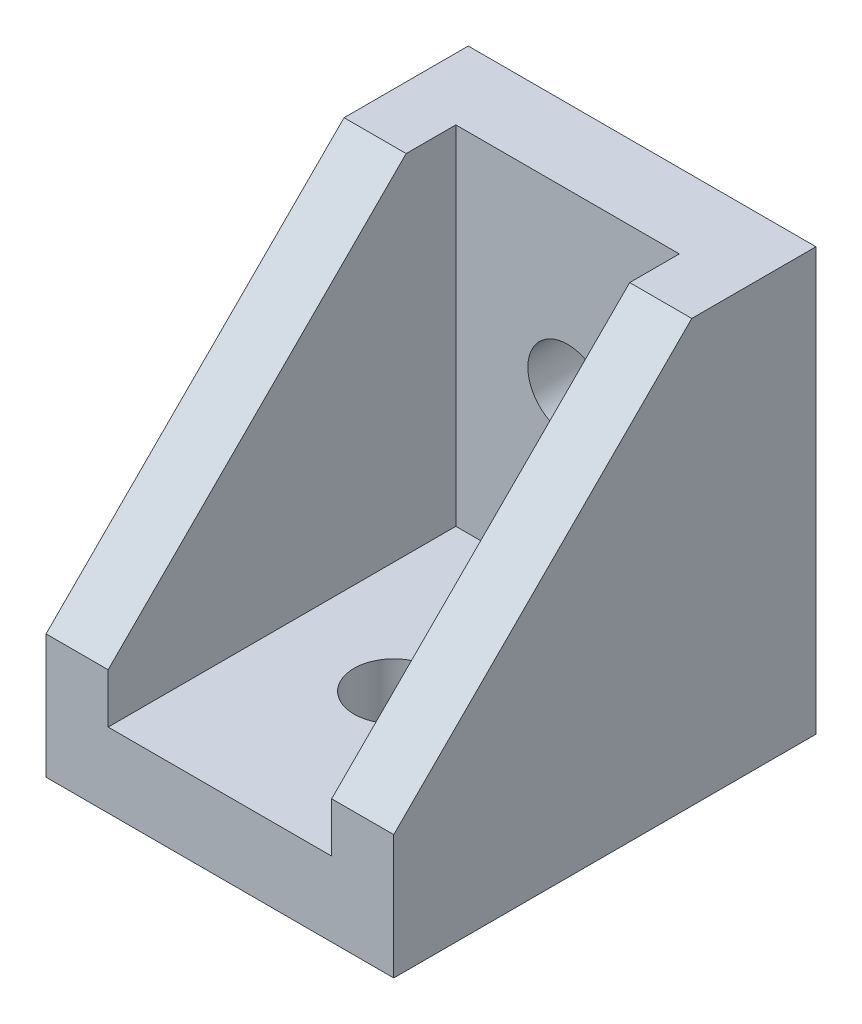
ISO-10303-21;
HEADER;
FILE_DESCRIPTION(('STEP AP214'),'2;1');
FILE_NAME('part.step','',(''),(''),'','','');
FILE_SCHEMA(('AUTOMOTIVE_DESIGN { 1 0 10303 214 1 1 1 1 }'));
ENDSEC;
DATA;
#1=APPLICATION_CONTEXT('core data for automotive mechanical design processes');
#2=APPLICATION_PROTOCOL_DEFINITION('international standard','automotive_design',2000,#1);
#3=PRODUCT_CONTEXT('',#1,'mechanical');
#4=PRODUCT('Part','Part','',(#3));
#5=PRODUCT_RELATED_PRODUCT_CATEGORY('part','',(#4));
#6=PRODUCT_DEFINITION_FORMATION('','',#4);
#7=PRODUCT_DEFINITION_CONTEXT('part definition',#1,'design');
#8=PRODUCT_DEFINITION('design','',#6,#7);
#9=PRODUCT_DEFINITION_SHAPE('','',#8);
#10=(LENGTH_UNIT() NAMED_UNIT(*) SI_UNIT(.MILLI.,.METRE.));
#11=(NAMED_UNIT(*) PLANE_ANGLE_UNIT() SI_UNIT($,.RADIAN.));
#12=(NAMED_UNIT(*) SI_UNIT($,.STERADIAN.) SOLID_ANGLE_UNIT());
#13=UNCERTAINTY_MEASURE_WITH_UNIT(LENGTH_MEASURE(1.E-05),#10,'distance_accuracy_value','');
#14=(GEOMETRIC_REPRESENTATION_CONTEXT(3) GLOBAL_UNCERTAINTY_ASSIGNED_CONTEXT((#13)) GLOBAL_UNIT_ASSIGNED_CONTEXT((#10,
#11,#12)) REPRESENTATION_CONTEXT('',''));
#15=CARTESIAN_POINT('',(0.,0.,0.));
#16=DIRECTION('',(0.,0.,1.));
#17=DIRECTION('',(1.,0.,0.));
#18=AXIS2_PLACEMENT_3D('',#15,#16,#17);
#19=CARTESIAN_POINT('',(0.,3.,0.));
#20=DIRECTION('',(0.,-1.,0.));
#21=DIRECTION('',(0.,0.,-1.));
#22=AXIS2_PLACEMENT_3D('',#19,#20,#21);
#23=PLANE('',#22);
#24=DIRECTION('',(1.,0.,0.));
#25=VECTOR('',#24,1.);
#26=CARTESIAN_POINT('',(-7.,3.,7.));
#27=LINE('',#26,#25);
#28=CARTESIAN_POINT('',(-4.5,3.,7.));
#29=VERTEX_POINT('',#28);
#30=CARTESIAN_POINT('',(4.5,3.,7.));
#31=VERTEX_POINT('',#30);
#32=EDGE_CURVE('E129',#29,#31,#27,.T.);
#33=ORIENTED_EDGE('',*,*,#32,.T.);
#34=DIRECTION('',(0.,0.,-1.));
#35=VECTOR('',#34,1.);
#36=CARTESIAN_POINT('',(4.5,3.,7.));
#37=LINE('',#36,#35);
#38=CARTESIAN_POINT('',(4.5,3.,-7.));
#39=VERTEX_POINT('',#38);
#40=EDGE_CURVE('E254',#31,#39,#37,.T.);
#41=ORIENTED_EDGE('',*,*,#40,.T.);
#42=DIRECTION('',(-1.,0.,0.));
#43=VECTOR('',#42,1.);
#44=CARTESIAN_POINT('',(-7.,3.,-7.));
#45=LINE('',#44,#43);
#46=CARTESIAN_POINT('',(-4.5,3.,-7.));
#47=VERTEX_POINT('',#46);
#48=EDGE_CURVE('E217',#39,#47,#45,.T.);
#49=ORIENTED_EDGE('',*,*,#48,.T.);
#50=DIRECTION('',(0.,0.,-1.));
#51=VECTOR('',#50,1.);
#52=CARTESIAN_POINT('',(-4.5,3.,7.));
#53=LINE('',#52,#51);
#54=EDGE_CURVE('E156',#29,#47,#53,.T.);
#55=ORIENTED_EDGE('',*,*,#54,.F.);
#56=EDGE_LOOP('',(#33,#41,#49,#55));
#57=FACE_BOUND('',#56,.T.);
#58=CARTESIAN_POINT('',(0.,3.,0.));
#59=DIRECTION('',(0.,1.,0.));
#60=DIRECTION('',(0.,0.,1.));
#61=AXIS2_PLACEMENT_3D('',#58,#59,#60);
#62=CIRCLE('',#61,1.6);
#63=CARTESIAN_POINT('',(0.,3.,1.6));
#64=VERTEX_POINT('',#63);
#65=EDGE_CURVE('E209',#64,#64,#62,.T.);
#66=ORIENTED_EDGE('',*,*,#65,.F.);
#67=EDGE_LOOP('',(#66));
#68=FACE_BOUND('',#67,.T.);
#69=ADVANCED_FACE('F43',(#57,#68),#23,.F.);
#70=CARTESIAN_POINT('',(0.,0.,0.));
#71=DIRECTION('',(0.,-1.,0.));
#72=DIRECTION('',(0.,0.,-1.));
#73=AXIS2_PLACEMENT_3D('',#70,#71,#72);
#74=PLANE('',#73);
#75=DIRECTION('',(0.,0.,-1.));
#76=VECTOR('',#75,1.);
#77=CARTESIAN_POINT('',(7.,0.,7.));
#78=LINE('',#77,#76);
#79=CARTESIAN_POINT('',(7.,0.,7.));
#80=VERTEX_POINT('',#79);
#81=CARTESIAN_POINT('',(7.,0.,-10.));
#82=VERTEX_POINT('',#81);
#83=EDGE_CURVE('E213',#80,#82,#78,.T.);
#84=ORIENTED_EDGE('',*,*,#83,.F.);
#85=DIRECTION('',(1.,0.,0.));
#86=VECTOR('',#85,1.);
#87=CARTESIAN_POINT('',(-7.,0.,7.));
#88=LINE('',#87,#86);
#89=CARTESIAN_POINT('',(-7.,0.,7.));
#90=VERTEX_POINT('',#89);
#91=EDGE_CURVE('E66',#90,#80,#88,.T.);
#92=ORIENTED_EDGE('',*,*,#91,.F.);
#93=DIRECTION('',(0.,0.,1.));
#94=VECTOR('',#93,1.);
#95=CARTESIAN_POINT('',(-7.,0.,7.));
#96=LINE('',#95,#94);
#97=CARTESIAN_POINT('',(-7.,0.,-10.));
#98=VERTEX_POINT('',#97);
#99=EDGE_CURVE('E225',#98,#90,#96,.T.);
#100=ORIENTED_EDGE('',*,*,#99,.F.);
#101=DIRECTION('',(-1.,0.,0.));
#102=VECTOR('',#101,1.);
#103=CARTESIAN_POINT('',(7.,0.,-10.));
#104=LINE('',#103,#102);
#105=EDGE_CURVE('E196',#82,#98,#104,.T.);
#106=ORIENTED_EDGE('',*,*,#105,.F.);
#107=EDGE_LOOP('',(#84,#92,#100,#106));
#108=FACE_BOUND('',#107,.T.);
#109=CARTESIAN_POINT('',(0.,0.,0.));
#110=DIRECTION('',(0.,1.,0.));
#111=DIRECTION('',(0.,0.,1.));
#112=AXIS2_PLACEMENT_3D('',#109,#110,#111);
#113=CIRCLE('',#112,1.6);
#114=CARTESIAN_POINT('',(0.,0.,1.6));
#115=VERTEX_POINT('',#114);
#116=EDGE_CURVE('E208',#115,#115,#113,.T.);
#117=ORIENTED_EDGE('',*,*,#116,.T.);
#118=EDGE_LOOP('',(#117));
#119=FACE_BOUND('',#118,.T.);
#120=ADVANCED_FACE('F238',(#108,#119),#74,.T.);
#121=CARTESIAN_POINT('',(7.,3.,7.));
#122=DIRECTION('',(-1.,0.,0.));
#123=DIRECTION('',(0.,0.,1.));
#124=AXIS2_PLACEMENT_3D('',#121,#122,#123);
#125=PLANE('',#124);
#126=ORIENTED_EDGE('',*,*,#83,.T.);
#127=DIRECTION('',(0.,-1.,0.));
#128=VECTOR('',#127,1.);
#129=CARTESIAN_POINT('',(7.,3.,-10.));
#130=LINE('',#129,#128);
#131=CARTESIAN_POINT('',(7.,17.,-10.));
#132=VERTEX_POINT('',#131);
#133=EDGE_CURVE('E192',#132,#82,#130,.T.);
#134=ORIENTED_EDGE('',*,*,#133,.F.);
#135=DIRECTION('',(0.,0.,1.));
#136=VECTOR('',#135,1.);
#137=CARTESIAN_POINT('',(7.,17.,-10.));
#138=LINE('',#137,#136);
#139=CARTESIAN_POINT('',(7.,17.,-5.));
#140=VERTEX_POINT('',#139);
#141=EDGE_CURVE('E134',#132,#140,#138,.T.);
#142=ORIENTED_EDGE('',*,*,#141,.T.);
#143=DIRECTION('',(0.,-0.707106781186548,0.707106781186548));
#144=VECTOR('',#143,1.);
#145=CARTESIAN_POINT('',(7.,17.,-5.));
#146=LINE('',#145,#144);
#147=CARTESIAN_POINT('',(7.,5.,7.));
#148=VERTEX_POINT('',#147);
#149=EDGE_CURVE('E131',#140,#148,#146,.T.);
#150=ORIENTED_EDGE('',*,*,#149,.T.);
#151=DIRECTION('',(0.,-1.,0.));
#152=VECTOR('',#151,1.);
#153=CARTESIAN_POINT('',(7.,3.,7.));
#154=LINE('',#153,#152);
#155=EDGE_CURVE('E52',#148,#80,#154,.T.);
#156=ORIENTED_EDGE('',*,*,#155,.T.);
#157=EDGE_LOOP('',(#126,#134,#142,#150,#156));
#158=FACE_BOUND('',#157,.T.);
#159=ADVANCED_FACE('F45',(#158),#125,.F.);
#160=CARTESIAN_POINT('',(-7.,3.,7.));
#161=DIRECTION('',(1.,0.,0.));
#162=DIRECTION('',(0.,0.,-1.));
#163=AXIS2_PLACEMENT_3D('',#160,#161,#162);
#164=PLANE('',#163);
#165=DIRECTION('',(0.,-1.,0.));
#166=VECTOR('',#165,1.);
#167=CARTESIAN_POINT('',(-7.,3.,7.));
#168=LINE('',#167,#166);
#169=CARTESIAN_POINT('',(-7.,5.,7.));
#170=VERTEX_POINT('',#169);
#171=EDGE_CURVE('E11',#170,#90,#168,.T.);
#172=ORIENTED_EDGE('',*,*,#171,.F.);
#173=DIRECTION('',(0.,-0.707106781186548,0.707106781186548));
#174=VECTOR('',#173,1.);
#175=CARTESIAN_POINT('',(-7.,17.,-5.));
#176=LINE('',#175,#174);
#177=CARTESIAN_POINT('',(-7.,17.,-5.));
#178=VERTEX_POINT('',#177);
#179=EDGE_CURVE('E151',#178,#170,#176,.T.);
#180=ORIENTED_EDGE('',*,*,#179,.F.);
#181=DIRECTION('',(0.,0.,1.));
#182=VECTOR('',#181,1.);
#183=CARTESIAN_POINT('',(-7.,17.,-10.));
#184=LINE('',#183,#182);
#185=CARTESIAN_POINT('',(-7.,17.,-10.));
#186=VERTEX_POINT('',#185);
#187=EDGE_CURVE('E205',#186,#178,#184,.T.);
#188=ORIENTED_EDGE('',*,*,#187,.F.);
#189=DIRECTION('',(0.,1.,0.));
#190=VECTOR('',#189,1.);
#191=CARTESIAN_POINT('',(-7.,3.,-10.));
#192=LINE('',#191,#190);
#193=EDGE_CURVE('E185',#98,#186,#192,.T.);
#194=ORIENTED_EDGE('',*,*,#193,.F.);
#195=ORIENTED_EDGE('',*,*,#99,.T.);
#196=EDGE_LOOP('',(#172,#180,#188,#194,#195));
#197=FACE_BOUND('',#196,.T.);
#198=ADVANCED_FACE('F231',(#197),#164,.F.);
#199=CARTESIAN_POINT('',(-7.,3.,7.));
#200=DIRECTION('',(0.,0.,-1.));
#201=DIRECTION('',(-1.,0.,0.));
#202=AXIS2_PLACEMENT_3D('',#199,#200,#201);
#203=PLANE('',#202);
#204=ORIENTED_EDGE('',*,*,#91,.T.);
#205=ORIENTED_EDGE('',*,*,#155,.F.);
#206=DIRECTION('',(-1.,0.,0.));
#207=VECTOR('',#206,1.);
#208=CARTESIAN_POINT('',(7.,5.,7.));
#209=LINE('',#208,#207);
#210=CARTESIAN_POINT('',(4.5,5.,7.));
#211=VERTEX_POINT('',#210);
#212=EDGE_CURVE('E124',#148,#211,#209,.T.);
#213=ORIENTED_EDGE('',*,*,#212,.T.);
#214=DIRECTION('',(0.,-1.,0.));
#215=VECTOR('',#214,1.);
#216=CARTESIAN_POINT('',(4.5,5.,7.));
#217=LINE('',#216,#215);
#218=EDGE_CURVE('E249',#211,#31,#217,.T.);
#219=ORIENTED_EDGE('',*,*,#218,.T.);
#220=ORIENTED_EDGE('',*,*,#32,.F.);
#221=DIRECTION('',(0.,-1.,0.));
#222=VECTOR('',#221,1.);
#223=CARTESIAN_POINT('',(-4.5,5.,7.));
#224=LINE('',#223,#222);
#225=CARTESIAN_POINT('',(-4.5,5.,7.));
#226=VERTEX_POINT('',#225);
#227=EDGE_CURVE('E166',#226,#29,#224,.T.);
#228=ORIENTED_EDGE('',*,*,#227,.F.);
#229=DIRECTION('',(1.,0.,0.));
#230=VECTOR('',#229,1.);
#231=CARTESIAN_POINT('',(-7.,5.,7.));
#232=LINE('',#231,#230);
#233=EDGE_CURVE('E171',#170,#226,#232,.T.);
#234=ORIENTED_EDGE('',*,*,#233,.F.);
#235=ORIENTED_EDGE('',*,*,#171,.T.);
#236=EDGE_LOOP('',(#204,#205,#213,#219,#220,#228,#234,#235));
#237=FACE_BOUND('',#236,.T.);
#238=ADVANCED_FACE('F122',(#237),#203,.F.);
#239=CARTESIAN_POINT('',(0.,3.,0.));
#240=DIRECTION('',(0.,-1.,0.));
#241=DIRECTION('',(0.,0.,-1.));
#242=AXIS2_PLACEMENT_3D('',#239,#240,#241);
#243=CYLINDRICAL_SURFACE('',#242,1.6);
#244=ORIENTED_EDGE('',*,*,#65,.T.);
#245=EDGE_LOOP('',(#244));
#246=FACE_BOUND('',#245,.T.);
#247=ORIENTED_EDGE('',*,*,#116,.F.);
#248=EDGE_LOOP('',(#247));
#249=FACE_BOUND('',#248,.T.);
#250=ADVANCED_FACE('F280',(#246,#249),#243,.F.);
#251=CARTESIAN_POINT('',(0.,0.,-7.));
#252=DIRECTION('',(0.,0.,1.));
#253=DIRECTION('',(1.,0.,0.));
#254=AXIS2_PLACEMENT_3D('',#251,#252,#253);
#255=PLANE('',#254);
#256=DIRECTION('',(0.,1.,0.));
#257=VECTOR('',#256,1.);
#258=CARTESIAN_POINT('',(4.5,3.,-7.));
#259=LINE('',#258,#257);
#260=CARTESIAN_POINT('',(4.5,17.,-7.));
#261=VERTEX_POINT('',#260);
#262=EDGE_CURVE('E260',#39,#261,#259,.T.);
#263=ORIENTED_EDGE('',*,*,#262,.T.);
#264=DIRECTION('',(1.,0.,0.));
#265=VECTOR('',#264,1.);
#266=CARTESIAN_POINT('',(7.,17.,-7.));
#267=LINE('',#266,#265);
#268=CARTESIAN_POINT('',(-4.5,17.,-7.));
#269=VERTEX_POINT('',#268);
#270=EDGE_CURVE('E181',#269,#261,#267,.T.);
#271=ORIENTED_EDGE('',*,*,#270,.F.);
#272=DIRECTION('',(0.,1.,0.));
#273=VECTOR('',#272,1.);
#274=CARTESIAN_POINT('',(-4.5,3.,-7.));
#275=LINE('',#274,#273);
#276=EDGE_CURVE('E59',#47,#269,#275,.T.);
#277=ORIENTED_EDGE('',*,*,#276,.F.);
#278=ORIENTED_EDGE('',*,*,#48,.F.);
#279=EDGE_LOOP('',(#263,#271,#277,#278));
#280=FACE_BOUND('',#279,.T.);
#281=CARTESIAN_POINT('',(0.,10.,-7.));
#282=DIRECTION('',(0.,0.,-1.));
#283=DIRECTION('',(-1.,0.,0.));
#284=AXIS2_PLACEMENT_3D('',#281,#282,#283);
#285=CIRCLE('',#284,1.6);
#286=CARTESIAN_POINT('',(-1.6,10.,-7.));
#287=VERTEX_POINT('',#286);
#288=EDGE_CURVE('E174',#287,#287,#285,.T.);
#289=ORIENTED_EDGE('',*,*,#288,.T.);
#290=EDGE_LOOP('',(#289));
#291=FACE_BOUND('',#290,.T.);
#292=ADVANCED_FACE('F265',(#280,#291),#255,.T.);
#293=CARTESIAN_POINT('',(0.,0.,-10.));
#294=DIRECTION('',(0.,0.,1.));
#295=DIRECTION('',(1.,0.,0.));
#296=AXIS2_PLACEMENT_3D('',#293,#294,#295);
#297=PLANE('',#296);
#298=ORIENTED_EDGE('',*,*,#193,.T.);
#299=DIRECTION('',(1.,0.,0.));
#300=VECTOR('',#299,1.);
#301=CARTESIAN_POINT('',(7.,17.,-10.));
#302=LINE('',#301,#300);
#303=EDGE_CURVE('E189',#186,#132,#302,.T.);
#304=ORIENTED_EDGE('',*,*,#303,.T.);
#305=ORIENTED_EDGE('',*,*,#133,.T.);
#306=ORIENTED_EDGE('',*,*,#105,.T.);
#307=EDGE_LOOP('',(#298,#304,#305,#306));
#308=FACE_BOUND('',#307,.T.);
#309=CARTESIAN_POINT('',(0.,10.,-10.));
#310=DIRECTION('',(0.,0.,-1.));
#311=DIRECTION('',(-1.,0.,0.));
#312=AXIS2_PLACEMENT_3D('',#309,#310,#311);
#313=CIRCLE('',#312,1.6);
#314=CARTESIAN_POINT('',(-1.6,10.,-10.));
#315=VERTEX_POINT('',#314);
#316=EDGE_CURVE('E177',#315,#315,#313,.T.);
#317=ORIENTED_EDGE('',*,*,#316,.F.);
#318=EDGE_LOOP('',(#317));
#319=FACE_BOUND('',#318,.T.);
#320=ADVANCED_FACE('F241',(#308,#319),#297,.F.);
#321=CARTESIAN_POINT('',(7.,17.,-10.));
#322=DIRECTION('',(0.,-1.,0.));
#323=DIRECTION('',(0.,0.,-1.));
#324=AXIS2_PLACEMENT_3D('',#321,#322,#323);
#325=PLANE('',#324);
#326=ORIENTED_EDGE('',*,*,#187,.T.);
#327=DIRECTION('',(1.,0.,0.));
#328=VECTOR('',#327,1.);
#329=CARTESIAN_POINT('',(-7.,17.,-5.));
#330=LINE('',#329,#328);
#331=CARTESIAN_POINT('',(-4.5,17.,-5.));
#332=VERTEX_POINT('',#331);
#333=EDGE_CURVE('E155',#178,#332,#330,.T.);
#334=ORIENTED_EDGE('',*,*,#333,.T.);
#335=DIRECTION('',(0.,0.,1.));
#336=VECTOR('',#335,1.);
#337=CARTESIAN_POINT('',(-4.5,17.,-7.));
#338=LINE('',#337,#336);
#339=EDGE_CURVE('E159',#269,#332,#338,.T.);
#340=ORIENTED_EDGE('',*,*,#339,.F.);
#341=ORIENTED_EDGE('',*,*,#270,.T.);
#342=DIRECTION('',(0.,0.,1.));
#343=VECTOR('',#342,1.);
#344=CARTESIAN_POINT('',(4.5,17.,-7.));
#345=LINE('',#344,#343);
#346=CARTESIAN_POINT('',(4.5,17.,-5.));
#347=VERTEX_POINT('',#346);
#348=EDGE_CURVE('E139',#261,#347,#345,.T.);
#349=ORIENTED_EDGE('',*,*,#348,.T.);
#350=DIRECTION('',(-1.,0.,0.));
#351=VECTOR('',#350,1.);
#352=CARTESIAN_POINT('',(7.,17.,-5.));
#353=LINE('',#352,#351);
#354=EDGE_CURVE('E145',#140,#347,#353,.T.);
#355=ORIENTED_EDGE('',*,*,#354,.F.);
#356=ORIENTED_EDGE('',*,*,#141,.F.);
#357=ORIENTED_EDGE('',*,*,#303,.F.);
#358=EDGE_LOOP('',(#326,#334,#340,#341,#349,#355,#356,#357));
#359=FACE_BOUND('',#358,.T.);
#360=ADVANCED_FACE('F244',(#359),#325,.F.);
#361=CARTESIAN_POINT('',(0.,10.,-10.));
#362=DIRECTION('',(0.,0.,1.));
#363=DIRECTION('',(1.,0.,0.));
#364=AXIS2_PLACEMENT_3D('',#361,#362,#363);
#365=CYLINDRICAL_SURFACE('',#364,1.6);
#366=ORIENTED_EDGE('',*,*,#316,.T.);
#367=EDGE_LOOP('',(#366));
#368=FACE_BOUND('',#367,.T.);
#369=ORIENTED_EDGE('',*,*,#288,.F.);
#370=EDGE_LOOP('',(#369));
#371=FACE_BOUND('',#370,.T.);
#372=ADVANCED_FACE('F325',(#368,#371),#365,.F.);
#373=CARTESIAN_POINT('',(-7.,17.,-5.));
#374=DIRECTION('',(0.,0.707106781186548,0.707106781186548));
#375=DIRECTION('',(0.,-0.707106781186548,0.707106781186548));
#376=AXIS2_PLACEMENT_3D('',#373,#374,#375);
#377=PLANE('',#376);
#378=DIRECTION('',(0.,-0.707106781186548,0.707106781186548));
#379=VECTOR('',#378,1.);
#380=CARTESIAN_POINT('',(-4.5,17.,-5.));
#381=LINE('',#380,#379);
#382=EDGE_CURVE('E162',#332,#226,#381,.T.);
#383=ORIENTED_EDGE('',*,*,#382,.F.);
#384=ORIENTED_EDGE('',*,*,#333,.F.);
#385=ORIENTED_EDGE('',*,*,#179,.T.);
#386=ORIENTED_EDGE('',*,*,#233,.T.);
#387=EDGE_LOOP('',(#383,#384,#385,#386));
#388=FACE_BOUND('',#387,.T.);
#389=ADVANCED_FACE('F272',(#388),#377,.T.);
#390=CARTESIAN_POINT('',(-4.5,0.,0.));
#391=DIRECTION('',(1.,0.,0.));
#392=DIRECTION('',(0.,0.,-1.));
#393=AXIS2_PLACEMENT_3D('',#390,#391,#392);
#394=PLANE('',#393);
#395=ORIENTED_EDGE('',*,*,#276,.T.);
#396=ORIENTED_EDGE('',*,*,#339,.T.);
#397=ORIENTED_EDGE('',*,*,#382,.T.);
#398=ORIENTED_EDGE('',*,*,#227,.T.);
#399=ORIENTED_EDGE('',*,*,#54,.T.);
#400=EDGE_LOOP('',(#395,#396,#397,#398,#399));
#401=FACE_BOUND('',#400,.T.);
#402=ADVANCED_FACE('F269',(#401),#394,.T.);
#403=CARTESIAN_POINT('',(7.,17.,-5.));
#404=DIRECTION('',(0.,-0.707106781186548,-0.707106781186548));
#405=DIRECTION('',(0.,0.707106781186548,-0.707106781186548));
#406=AXIS2_PLACEMENT_3D('',#403,#404,#405);
#407=PLANE('',#406);
#408=DIRECTION('',(0.,-0.707106781186548,0.707106781186548));
#409=VECTOR('',#408,1.);
#410=CARTESIAN_POINT('',(4.5,17.,-5.));
#411=LINE('',#410,#409);
#412=EDGE_CURVE('E143',#347,#211,#411,.T.);
#413=ORIENTED_EDGE('',*,*,#412,.T.);
#414=ORIENTED_EDGE('',*,*,#212,.F.);
#415=ORIENTED_EDGE('',*,*,#149,.F.);
#416=ORIENTED_EDGE('',*,*,#354,.T.);
#417=EDGE_LOOP('',(#413,#414,#415,#416));
#418=FACE_BOUND('',#417,.T.);
#419=ADVANCED_FACE('F141',(#418),#407,.F.);
#420=CARTESIAN_POINT('',(4.5,0.,0.));
#421=DIRECTION('',(-1.,0.,0.));
#422=DIRECTION('',(0.,0.,-1.));
#423=AXIS2_PLACEMENT_3D('',#420,#421,#422);
#424=PLANE('',#423);
#425=ORIENTED_EDGE('',*,*,#262,.F.);
#426=ORIENTED_EDGE('',*,*,#40,.F.);
#427=ORIENTED_EDGE('',*,*,#218,.F.);
#428=ORIENTED_EDGE('',*,*,#412,.F.);
#429=ORIENTED_EDGE('',*,*,#348,.F.);
#430=EDGE_LOOP('',(#425,#426,#427,#428,#429));
#431=FACE_BOUND('',#430,.T.);
#432=ADVANCED_FACE('F246',(#431),#424,.T.);
#433=CLOSED_SHELL('',(#69,#120,#159,#198,#238,#250,#292,#320,#360,#372,#389,#402,#419,#432));
#434=MANIFOLD_SOLID_BREP('B2',#433);
#435=ADVANCED_BREP_SHAPE_REPRESENTATION('',(#18,#434),#14);
#436=SHAPE_DEFINITION_REPRESENTATION(#9,#435);
ENDSEC;
END-ISO-10303-21;
